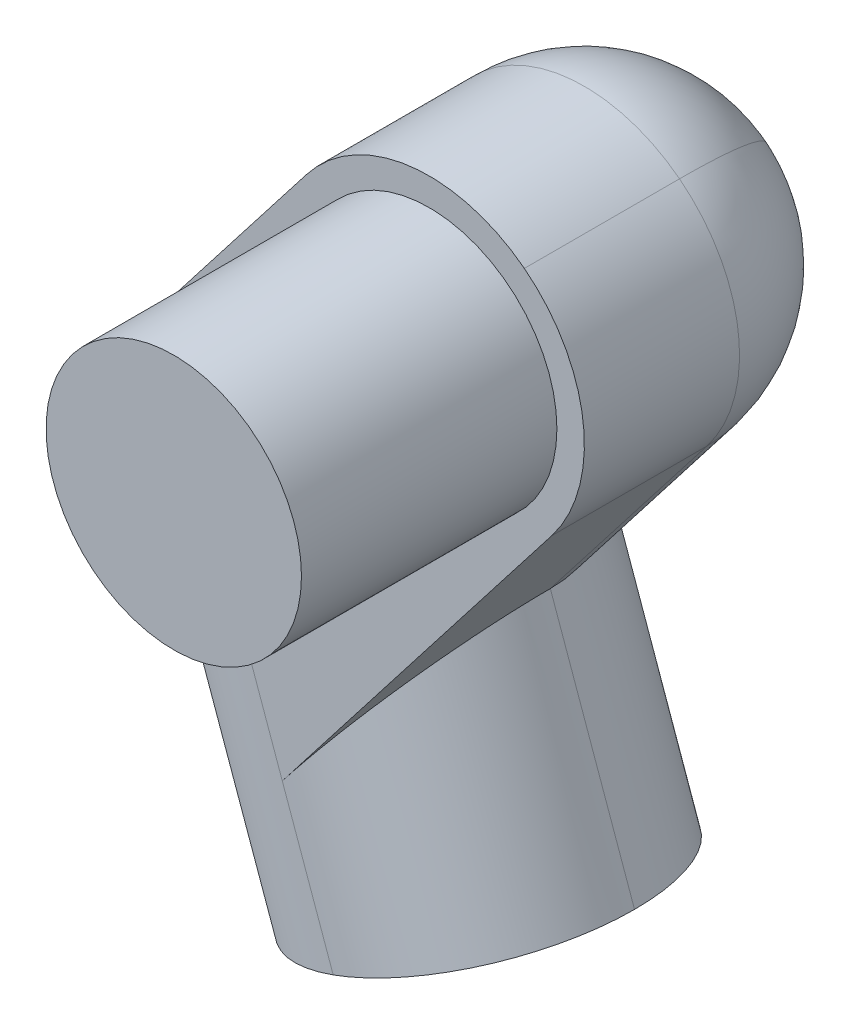
ISO-10303-21;
HEADER;
FILE_DESCRIPTION(('STEP AP214'),'2;1');
FILE_NAME('part.step','',(''),(''),'','','');
FILE_SCHEMA(('AUTOMOTIVE_DESIGN { 1 0 10303 214 1 1 1 1 }'));
ENDSEC;
DATA;
#1=APPLICATION_CONTEXT('core data for automotive mechanical design processes');
#2=APPLICATION_PROTOCOL_DEFINITION('international standard','automotive_design',2000,#1);
#3=PRODUCT_CONTEXT('',#1,'mechanical');
#4=PRODUCT('Part','Part','',(#3));
#5=PRODUCT_RELATED_PRODUCT_CATEGORY('part','',(#4));
#6=PRODUCT_DEFINITION_FORMATION('','',#4);
#7=PRODUCT_DEFINITION_CONTEXT('part definition',#1,'design');
#8=PRODUCT_DEFINITION('design','',#6,#7);
#9=PRODUCT_DEFINITION_SHAPE('','',#8);
#10=(LENGTH_UNIT() NAMED_UNIT(*) SI_UNIT(.MILLI.,.METRE.));
#11=(NAMED_UNIT(*) PLANE_ANGLE_UNIT() SI_UNIT($,.RADIAN.));
#12=(NAMED_UNIT(*) SI_UNIT($,.STERADIAN.) SOLID_ANGLE_UNIT());
#13=UNCERTAINTY_MEASURE_WITH_UNIT(LENGTH_MEASURE(1.E-05),#10,'distance_accuracy_value','');
#14=(GEOMETRIC_REPRESENTATION_CONTEXT(3) GLOBAL_UNCERTAINTY_ASSIGNED_CONTEXT((#13)) GLOBAL_UNIT_ASSIGNED_CONTEXT((#10,
#11,#12)) REPRESENTATION_CONTEXT('',''));
#15=CARTESIAN_POINT('',(0.,0.,0.));
#16=DIRECTION('',(0.,0.,1.));
#17=DIRECTION('',(1.,0.,0.));
#18=AXIS2_PLACEMENT_3D('',#15,#16,#17);
#19=CARTESIAN_POINT('',(-58.6295193195852,184.947102533796,123.444));
#20=DIRECTION('',(0.789946750213018,-0.613175449466049,0.));
#21=DIRECTION('',(0.613175449466049,0.789946750213018,0.));
#22=AXIS2_PLACEMENT_3D('',#19,#20,#21);
#23=PLANE('',#22);
#24=DIRECTION('',(-0.613175449466049,-0.789946750213018,0.));
#25=VECTOR('',#24,1.);
#26=CARTESIAN_POINT('',(-58.6295193195852,184.947102533796,123.444));
#27=LINE('',#26,#25);
#28=CARTESIAN_POINT('',(-96.4759344115287,136.190009217148,123.444));
#29=VERTEX_POINT('',#28);
#30=CARTESIAN_POINT('',(-155.390700532791,60.2908060158817,123.444));
#31=VERTEX_POINT('',#30);
#32=EDGE_CURVE('E96',#29,#31,#27,.T.);
#33=ORIENTED_EDGE('',*,*,#32,.F.);
#34=DIRECTION('',(0.,0.,-1.));
#35=VECTOR('',#34,1.);
#36=CARTESIAN_POINT('',(-96.4759344115287,136.190009217148,123.444));
#37=LINE('',#36,#35);
#38=CARTESIAN_POINT('',(-96.4759344115287,136.190009217148,61.722));
#39=VERTEX_POINT('',#38);
#40=EDGE_CURVE('E161',#29,#39,#37,.T.);
#41=ORIENTED_EDGE('',*,*,#40,.T.);
#42=DIRECTION('',(-0.613175449466049,-0.789946750213018,0.));
#43=VECTOR('',#42,1.);
#44=CARTESIAN_POINT('',(-58.6295193195852,184.947102533796,61.722));
#45=LINE('',#44,#43);
#46=CARTESIAN_POINT('',(-200.278117002444,2.46287308650969,61.722));
#47=VERTEX_POINT('',#46);
#48=EDGE_CURVE('E111',#39,#47,#45,.T.);
#49=ORIENTED_EDGE('',*,*,#48,.T.);
#50=CARTESIAN_POINT('',(-155.390700532791,60.2908060158816,61.722));
#51=DIRECTION('',(0.789946750213018,-0.613175449466049,0.));
#52=DIRECTION('',(0.613175449466049,0.789946750213018,0.));
#53=AXIS2_PLACEMENT_3D('',#50,#51,#52);
#54=ELLIPSE('',#53,73.2048494582426,61.722);
#55=EDGE_CURVE('E110',#47,#31,#54,.F.);
#56=ORIENTED_EDGE('',*,*,#55,.T.);
#57=EDGE_LOOP('',(#33,#41,#49,#56));
#58=FACE_BOUND('',#57,.T.);
#59=ADVANCED_FACE('F35',(#58),#23,.F.);
#60=CARTESIAN_POINT('',(-27.7720310676711,-113.528769442056,123.444));
#61=DIRECTION('',(-0.336336396998156,0.941741911594837,0.));
#62=DIRECTION('',(-0.941741911594838,-0.336336396998156,0.));
#63=AXIS2_PLACEMENT_3D('',#60,#61,#62);
#64=PLANE('',#63);
#65=CARTESIAN_POINT('',(-85.8982253351276,-134.288124537577,61.722));
#66=DIRECTION('',(0.336336396998156,-0.941741911594837,0.));
#67=DIRECTION('',(0.941741911594837,0.336336396998156,0.));
#68=AXIS2_PLACEMENT_3D('',#65,#66,#67);
#69=CIRCLE('',#68,50.8);
#70=CARTESIAN_POINT('',(-38.0577362261099,-117.20223557007,61.722));
#71=VERTEX_POINT('',#70);
#72=EDGE_CURVE('E257',#71,#71,#69,.T.);
#73=ORIENTED_EDGE('',*,*,#72,.F.);
#74=EDGE_LOOP('',(#73));
#75=FACE_BOUND('',#74,.T.);
#76=CARTESIAN_POINT('',(-85.8982253351276,-134.288124537577,61.722));
#77=DIRECTION('',(-0.336336396998156,0.941741911594837,0.));
#78=DIRECTION('',(-0.941741911594838,-0.336336396998156,0.));
#79=AXIS2_PLACEMENT_3D('',#76,#77,#78);
#80=CIRCLE('',#79,61.722);
#81=CARTESIAN_POINT('',(-27.7720310676711,-113.528769442056,61.722));
#82=VERTEX_POINT('',#81);
#83=CARTESIAN_POINT('',(-85.8982253351276,-134.288124537577,123.444));
#84=VERTEX_POINT('',#83);
#85=EDGE_CURVE('E129',#82,#84,#80,.F.);
#86=ORIENTED_EDGE('',*,*,#85,.T.);
#87=CARTESIAN_POINT('',(-85.8982253351276,-134.288124537577,61.722));
#88=DIRECTION('',(-0.336336396998156,0.941741911594837,0.));
#89=DIRECTION('',(-0.941741911594838,-0.336336396998156,0.));
#90=AXIS2_PLACEMENT_3D('',#87,#88,#89);
#91=CIRCLE('',#90,61.722);
#92=CARTESIAN_POINT('',(-144.024419602584,-155.047479633097,61.722));
#93=VERTEX_POINT('',#92);
#94=EDGE_CURVE('E131',#84,#93,#91,.F.);
#95=ORIENTED_EDGE('',*,*,#94,.T.);
#96=CARTESIAN_POINT('',(-85.8982253351276,-134.288124537577,61.722));
#97=DIRECTION('',(-0.336336396998156,0.941741911594837,0.));
#98=DIRECTION('',(-0.941741911594838,-0.336336396998156,0.));
#99=AXIS2_PLACEMENT_3D('',#96,#97,#98);
#100=CIRCLE('',#99,61.722);
#101=CARTESIAN_POINT('',(-85.8982253351276,-134.288124537577,0.));
#102=VERTEX_POINT('',#101);
#103=EDGE_CURVE('E124',#93,#102,#100,.F.);
#104=ORIENTED_EDGE('',*,*,#103,.T.);
#105=CARTESIAN_POINT('',(-85.8982253351276,-134.288124537577,61.722));
#106=DIRECTION('',(-0.336336396998156,0.941741911594837,0.));
#107=DIRECTION('',(-0.941741911594838,-0.336336396998156,0.));
#108=AXIS2_PLACEMENT_3D('',#105,#106,#107);
#109=CIRCLE('',#108,61.722);
#110=EDGE_CURVE('E122',#102,#82,#109,.F.);
#111=ORIENTED_EDGE('',*,*,#110,.T.);
#112=EDGE_LOOP('',(#86,#95,#104,#111));
#113=FACE_BOUND('',#112,.T.);
#114=ADVANCED_FACE('F205',(#75,#113),#64,.F.);
#115=CARTESIAN_POINT('',(-61.2603734439835,-19.7614107883817,123.444));
#116=DIRECTION('',(-0.789946750213018,0.613175449466049,0.));
#117=DIRECTION('',(-0.61317544946605,-0.789946750213018,0.));
#118=AXIS2_PLACEMENT_3D('',#115,#116,#117);
#119=PLANE('',#118);
#120=DIRECTION('',(0.61317544946605,0.789946750213018,0.));
#121=VECTOR('',#120,1.);
#122=CARTESIAN_POINT('',(-61.2603734439835,-19.7614107883817,61.722));
#123=LINE('',#122,#121);
#124=CARTESIAN_POINT('',(-61.2603734439835,-19.7614107883817,61.722));
#125=VERTEX_POINT('',#124);
#126=CARTESIAN_POINT('',(1.03825222176712,60.4971790332609,61.722));
#127=VERTEX_POINT('',#126);
#128=EDGE_CURVE('E114',#125,#127,#123,.T.);
#129=ORIENTED_EDGE('',*,*,#128,.T.);
#130=DIRECTION('',(0.,0.,-1.));
#131=VECTOR('',#130,1.);
#132=CARTESIAN_POINT('',(1.03825222176712,60.4971790332609,123.444));
#133=LINE('',#132,#131);
#134=CARTESIAN_POINT('',(1.03825222176712,60.4971790332609,123.444));
#135=VERTEX_POINT('',#134);
#136=EDGE_CURVE('E139',#127,#135,#133,.F.);
#137=ORIENTED_EDGE('',*,*,#136,.T.);
#138=DIRECTION('',(0.61317544946605,0.789946750213018,0.));
#139=VECTOR('',#138,1.);
#140=CARTESIAN_POINT('',(-61.2603734439835,-19.7614107883817,123.444));
#141=LINE('',#140,#139);
#142=CARTESIAN_POINT('',(-106.147789913636,-77.5893437177536,123.444));
#143=VERTEX_POINT('',#142);
#144=EDGE_CURVE('E106',#143,#135,#141,.T.);
#145=ORIENTED_EDGE('',*,*,#144,.F.);
#146=CARTESIAN_POINT('',(-106.147789913636,-77.5893437177536,61.722));
#147=DIRECTION('',(-0.789946750213018,0.613175449466049,0.));
#148=DIRECTION('',(-0.61317544946605,-0.789946750213018,0.));
#149=AXIS2_PLACEMENT_3D('',#146,#147,#148);
#150=ELLIPSE('',#149,73.2048494582426,61.722);
#151=EDGE_CURVE('E137',#143,#125,#150,.T.);
#152=ORIENTED_EDGE('',*,*,#151,.T.);
#153=EDGE_LOOP('',(#129,#137,#145,#152));
#154=FACE_BOUND('',#153,.T.);
#155=ADVANCED_FACE('F189',(#154),#119,.F.);
#156=CARTESIAN_POINT('',(0.,0.,123.444));
#157=DIRECTION('',(0.,0.,1.));
#158=DIRECTION('',(1.,0.,0.));
#159=AXIS2_PLACEMENT_3D('',#156,#157,#158);
#160=PLANE('',#159);
#161=CARTESIAN_POINT('',(-47.7188410948807,98.3435941252044,123.444));
#162=DIRECTION('',(0.,0.,1.));
#163=DIRECTION('',(1.,0.,0.));
#164=AXIS2_PLACEMENT_3D('',#161,#162,#163);
#165=CIRCLE('',#164,50.8);
#166=CARTESIAN_POINT('',(3.08115890511925,98.3435941252044,123.444));
#167=VERTEX_POINT('',#166);
#168=EDGE_CURVE('E256',#167,#167,#165,.T.);
#169=ORIENTED_EDGE('',*,*,#168,.F.);
#170=EDGE_LOOP('',(#169));
#171=FACE_BOUND('',#170,.T.);
#172=ORIENTED_EDGE('',*,*,#144,.T.);
#173=CARTESIAN_POINT('',(-47.7188410948808,98.3435941252044,123.444));
#174=DIRECTION('',(0.,0.,1.));
#175=DIRECTION('',(1.,0.,0.));
#176=AXIS2_PLACEMENT_3D('',#173,#174,#175);
#177=CIRCLE('',#176,61.722);
#178=CARTESIAN_POINT('',(-9.87242600293724,147.100687441852,123.444));
#179=VERTEX_POINT('',#178);
#180=EDGE_CURVE('E159',#135,#179,#177,.T.);
#181=ORIENTED_EDGE('',*,*,#180,.T.);
#182=CARTESIAN_POINT('',(-47.7188410948808,98.3435941252044,123.444));
#183=DIRECTION('',(0.,0.,1.));
#184=DIRECTION('',(1.,0.,0.));
#185=AXIS2_PLACEMENT_3D('',#182,#183,#184);
#186=CIRCLE('',#185,61.722);
#187=EDGE_CURVE('E103',#179,#29,#186,.T.);
#188=ORIENTED_EDGE('',*,*,#187,.T.);
#189=ORIENTED_EDGE('',*,*,#32,.T.);
#190=DIRECTION('',(0.336336396998156,-0.941741911594838,0.));
#191=VECTOR('',#190,1.);
#192=CARTESIAN_POINT('',(-85.8982253351276,-134.288124537577,123.444));
#193=LINE('',#192,#191);
#194=EDGE_CURVE('E101',#31,#143,#193,.T.);
#195=ORIENTED_EDGE('',*,*,#194,.T.);
#196=EDGE_LOOP('',(#172,#181,#188,#189,#195));
#197=FACE_BOUND('',#196,.T.);
#198=ADVANCED_FACE('F99',(#171,#197),#160,.T.);
#199=CARTESIAN_POINT('',(-110.017466760631,18.0850043035618,61.722));
#200=DIRECTION('',(0.61317544946605,0.789946750213018,0.));
#201=DIRECTION('',(-0.789946750213018,0.61317544946605,0.));
#202=AXIS2_PLACEMENT_3D('',#199,#200,#201);
#203=CYLINDRICAL_SURFACE('',#202,61.722);
#204=DIRECTION('',(0.61317544946605,0.789946750213018,0.));
#205=VECTOR('',#204,1.);
#206=CARTESIAN_POINT('',(-77.4125862404207,60.0894900187881,0.));
#207=LINE('',#206,#205);
#208=CARTESIAN_POINT('',(-47.7188410948808,98.3435941252044,0.));
#209=VERTEX_POINT('',#208);
#210=CARTESIAN_POINT('',(-130.769245223214,-8.64926885093604,0.));
#211=VERTEX_POINT('',#210);
#212=EDGE_CURVE('E107',#209,#211,#207,.F.);
#213=ORIENTED_EDGE('',*,*,#212,.F.);
#214=CARTESIAN_POINT('',(-47.7188410948808,98.3435941252044,61.722));
#215=DIRECTION('',(0.61317544946605,0.789946750213018,0.));
#216=DIRECTION('',(-0.789946750213018,0.61317544946605,0.));
#217=AXIS2_PLACEMENT_3D('',#214,#215,#216);
#218=CIRCLE('',#217,61.722);
#219=EDGE_CURVE('E11',#209,#127,#218,.F.);
#220=ORIENTED_EDGE('',*,*,#219,.T.);
#221=ORIENTED_EDGE('',*,*,#128,.F.);
#222=CARTESIAN_POINT('',(-130.769245223214,-8.64926885093602,61.722));
#223=DIRECTION('',(0.15786199035095,0.987461185061183,0.));
#224=DIRECTION('',(-0.987461185061183,0.15786199035095,0.));
#225=AXIS2_PLACEMENT_3D('',#222,#223,#224);
#226=ELLIPSE('',#225,70.3914977426918,61.722);
#227=EDGE_CURVE('E152',#211,#125,#226,.F.);
#228=ORIENTED_EDGE('',*,*,#227,.F.);
#229=EDGE_LOOP('',(#213,#220,#221,#228));
#230=FACE_BOUND('',#229,.T.);
#231=ADVANCED_FACE('F185',(#230),#203,.T.);
#232=CARTESIAN_POINT('',(-9.87242600293726,147.100687441852,61.722));
#233=DIRECTION('',(-0.613175449466049,-0.789946750213018,0.));
#234=DIRECTION('',(0.789946750213018,-0.613175449466049,0.));
#235=AXIS2_PLACEMENT_3D('',#232,#233,#234);
#236=CYLINDRICAL_SURFACE('',#235,61.722);
#237=ORIENTED_EDGE('',*,*,#48,.F.);
#238=CARTESIAN_POINT('',(-47.7188410948808,98.3435941252044,61.722));
#239=DIRECTION('',(-0.613175449466049,-0.789946750213018,0.));
#240=DIRECTION('',(0.789946750213018,-0.613175449466049,0.));
#241=AXIS2_PLACEMENT_3D('',#238,#239,#240);
#242=CIRCLE('',#241,61.722);
#243=EDGE_CURVE('E45',#39,#209,#242,.T.);
#244=ORIENTED_EDGE('',*,*,#243,.T.);
#245=ORIENTED_EDGE('',*,*,#212,.T.);
#246=CARTESIAN_POINT('',(-130.769245223214,-8.64926885093609,61.722));
#247=DIRECTION('',(-0.15786199035095,-0.987461185061183,0.));
#248=DIRECTION('',(0.987461185061183,-0.15786199035095,0.));
#249=AXIS2_PLACEMENT_3D('',#246,#247,#248);
#250=ELLIPSE('',#249,70.3914977426918,61.722);
#251=EDGE_CURVE('E146',#47,#211,#250,.T.);
#252=ORIENTED_EDGE('',*,*,#251,.F.);
#253=EDGE_LOOP('',(#237,#244,#245,#252));
#254=FACE_BOUND('',#253,.T.);
#255=ADVANCED_FACE('F227',(#254),#236,.T.);
#256=CARTESIAN_POINT('',(-119.38656771144,-40.5207658839019,61.722));
#257=DIRECTION('',(-0.336336396998156,0.941741911594838,0.));
#258=DIRECTION('',(-0.941741911594838,-0.336336396998156,0.));
#259=AXIS2_PLACEMENT_3D('',#256,#257,#258);
#260=CYLINDRICAL_SURFACE('',#259,61.722);
#261=DIRECTION('',(-0.336336396998156,0.941741911594838,0.));
#262=VECTOR('',#261,1.);
#263=CARTESIAN_POINT('',(-61.2603734439835,-19.7614107883817,61.722));
#264=LINE('',#263,#262);
#265=EDGE_CURVE('E143',#82,#125,#264,.T.);
#266=ORIENTED_EDGE('',*,*,#265,.F.);
#267=ORIENTED_EDGE('',*,*,#110,.F.);
#268=DIRECTION('',(-0.336336396998156,0.941741911594838,0.));
#269=VECTOR('',#268,1.);
#270=CARTESIAN_POINT('',(-118.715931598712,-42.3985469995401,0.));
#271=LINE('',#270,#269);
#272=EDGE_CURVE('E149',#211,#102,#271,.F.);
#273=ORIENTED_EDGE('',*,*,#272,.F.);
#274=ORIENTED_EDGE('',*,*,#227,.T.);
#275=EDGE_LOOP('',(#266,#267,#273,#274));
#276=FACE_BOUND('',#275,.T.);
#277=ADVANCED_FACE('F223',(#276),#260,.T.);
#278=CARTESIAN_POINT('',(-85.8982253351276,-134.288124537577,61.722));
#279=DIRECTION('',(0.336336396998156,-0.941741911594838,0.));
#280=DIRECTION('',(0.941741911594838,0.336336396998156,0.));
#281=AXIS2_PLACEMENT_3D('',#278,#279,#280);
#282=CYLINDRICAL_SURFACE('',#281,61.722);
#283=ORIENTED_EDGE('',*,*,#272,.T.);
#284=ORIENTED_EDGE('',*,*,#103,.F.);
#285=DIRECTION('',(0.336336396998156,-0.941741911594838,0.));
#286=VECTOR('',#285,1.);
#287=CARTESIAN_POINT('',(-144.024419602584,-155.047479633097,61.722));
#288=LINE('',#287,#286);
#289=EDGE_CURVE('E141',#47,#93,#288,.T.);
#290=ORIENTED_EDGE('',*,*,#289,.F.);
#291=ORIENTED_EDGE('',*,*,#251,.T.);
#292=EDGE_LOOP('',(#283,#284,#290,#291));
#293=FACE_BOUND('',#292,.T.);
#294=ADVANCED_FACE('F219',(#293),#282,.T.);
#295=CARTESIAN_POINT('',(-118.715931598712,-42.3985469995401,61.722));
#296=DIRECTION('',(0.336336396998156,-0.941741911594838,0.));
#297=DIRECTION('',(0.941741911594838,0.336336396998156,0.));
#298=AXIS2_PLACEMENT_3D('',#295,#296,#297);
#299=CYLINDRICAL_SURFACE('',#298,61.722);
#300=ORIENTED_EDGE('',*,*,#265,.T.);
#301=ORIENTED_EDGE('',*,*,#151,.F.);
#302=DIRECTION('',(-0.336336396998156,0.941741911594838,0.));
#303=VECTOR('',#302,1.);
#304=CARTESIAN_POINT('',(-119.38656771144,-40.5207658839019,123.444));
#305=LINE('',#304,#303);
#306=EDGE_CURVE('E120',#84,#143,#305,.T.);
#307=ORIENTED_EDGE('',*,*,#306,.F.);
#308=ORIENTED_EDGE('',*,*,#85,.F.);
#309=EDGE_LOOP('',(#300,#301,#307,#308));
#310=FACE_BOUND('',#309,.T.);
#311=ADVANCED_FACE('F216',(#310),#299,.T.);
#312=CARTESIAN_POINT('',(-118.715931598712,-42.39854699954,61.722));
#313=DIRECTION('',(-0.336336396998156,0.941741911594838,0.));
#314=DIRECTION('',(-0.941741911594838,-0.336336396998156,0.));
#315=AXIS2_PLACEMENT_3D('',#312,#313,#314);
#316=CYLINDRICAL_SURFACE('',#315,61.722);
#317=ORIENTED_EDGE('',*,*,#55,.F.);
#318=ORIENTED_EDGE('',*,*,#289,.T.);
#319=ORIENTED_EDGE('',*,*,#94,.F.);
#320=ORIENTED_EDGE('',*,*,#306,.T.);
#321=ORIENTED_EDGE('',*,*,#194,.F.);
#322=EDGE_LOOP('',(#317,#318,#319,#320,#321));
#323=FACE_BOUND('',#322,.T.);
#324=ADVANCED_FACE('F117',(#323),#316,.T.);
#325=CARTESIAN_POINT('',(-47.7188410948808,98.3435941252044,61.722));
#326=DIRECTION('',(-0.613175449466049,-0.789946750213018,0.));
#327=DIRECTION('',(0.789946750213018,-0.613175449466049,0.));
#328=AXIS2_PLACEMENT_3D('',#325,#326,#327);
#329=SPHERICAL_SURFACE('',#328,61.722);
#330=CARTESIAN_POINT('',(-47.7188410948808,98.3435941252044,61.722));
#331=DIRECTION('',(0.789946750213018,-0.613175449466049,0.));
#332=DIRECTION('',(0.613175449466049,0.789946750213018,0.));
#333=AXIS2_PLACEMENT_3D('',#330,#331,#332);
#334=CIRCLE('',#333,61.722);
#335=CARTESIAN_POINT('',(-9.87242600293726,147.100687441852,61.722));
#336=VERTEX_POINT('',#335);
#337=EDGE_CURVE('E170',#209,#336,#334,.T.);
#338=ORIENTED_EDGE('',*,*,#337,.F.);
#339=ORIENTED_EDGE('',*,*,#243,.F.);
#340=CARTESIAN_POINT('',(-47.7188410948808,98.3435941252044,61.722));
#341=DIRECTION('',(0.,0.,1.));
#342=DIRECTION('',(1.,0.,0.));
#343=AXIS2_PLACEMENT_3D('',#340,#341,#342);
#344=CIRCLE('',#343,61.722);
#345=EDGE_CURVE('E39',#336,#39,#344,.T.);
#346=ORIENTED_EDGE('',*,*,#345,.F.);
#347=EDGE_LOOP('',(#338,#339,#346));
#348=FACE_BOUND('',#347,.T.);
#349=ADVANCED_FACE('F37',(#348),#329,.T.);
#350=CARTESIAN_POINT('',(-47.7188410948808,98.3435941252044,123.444));
#351=DIRECTION('',(0.,0.,-1.));
#352=DIRECTION('',(-1.,0.,0.));
#353=AXIS2_PLACEMENT_3D('',#350,#351,#352);
#354=CYLINDRICAL_SURFACE('',#353,61.722);
#355=ORIENTED_EDGE('',*,*,#40,.F.);
#356=ORIENTED_EDGE('',*,*,#187,.F.);
#357=DIRECTION('',(0.,0.,-1.));
#358=VECTOR('',#357,1.);
#359=CARTESIAN_POINT('',(-9.87242600293726,147.100687441852,123.444));
#360=LINE('',#359,#358);
#361=EDGE_CURVE('E167',#336,#179,#360,.F.);
#362=ORIENTED_EDGE('',*,*,#361,.F.);
#363=ORIENTED_EDGE('',*,*,#345,.T.);
#364=EDGE_LOOP('',(#355,#356,#362,#363));
#365=FACE_BOUND('',#364,.T.);
#366=ADVANCED_FACE('F180',(#365),#354,.T.);
#367=CARTESIAN_POINT('',(-47.7188410948808,98.3435941252044,61.722));
#368=DIRECTION('',(-0.613175449466049,-0.789946750213018,0.));
#369=DIRECTION('',(0.789946750213018,-0.613175449466049,0.));
#370=AXIS2_PLACEMENT_3D('',#367,#368,#369);
#371=SPHERICAL_SURFACE('',#370,61.722);
#372=ORIENTED_EDGE('',*,*,#219,.F.);
#373=ORIENTED_EDGE('',*,*,#337,.T.);
#374=CARTESIAN_POINT('',(-47.7188410948808,98.3435941252044,61.722));
#375=DIRECTION('',(0.,0.,1.));
#376=DIRECTION('',(1.,0.,0.));
#377=AXIS2_PLACEMENT_3D('',#374,#375,#376);
#378=CIRCLE('',#377,61.722);
#379=EDGE_CURVE('E164',#127,#336,#378,.T.);
#380=ORIENTED_EDGE('',*,*,#379,.F.);
#381=EDGE_LOOP('',(#372,#373,#380));
#382=FACE_BOUND('',#381,.T.);
#383=ADVANCED_FACE('F182',(#382),#371,.T.);
#384=CARTESIAN_POINT('',(-47.7188410948808,98.3435941252044,123.444));
#385=DIRECTION('',(0.,0.,-1.));
#386=DIRECTION('',(-1.,0.,0.));
#387=AXIS2_PLACEMENT_3D('',#384,#385,#386);
#388=CYLINDRICAL_SURFACE('',#387,61.722);
#389=ORIENTED_EDGE('',*,*,#180,.F.);
#390=ORIENTED_EDGE('',*,*,#136,.F.);
#391=ORIENTED_EDGE('',*,*,#379,.T.);
#392=ORIENTED_EDGE('',*,*,#361,.T.);
#393=EDGE_LOOP('',(#389,#390,#391,#392));
#394=FACE_BOUND('',#393,.T.);
#395=ADVANCED_FACE('F191',(#394),#388,.T.);
#396=CARTESIAN_POINT('',(-47.7188410948807,98.3435941252044,225.044));
#397=DIRECTION('',(0.,0.,-1.));
#398=DIRECTION('',(-1.,0.,0.));
#399=AXIS2_PLACEMENT_3D('',#396,#397,#398);
#400=CYLINDRICAL_SURFACE('',#399,50.8);
#401=CARTESIAN_POINT('',(-47.7188410948807,98.3435941252044,225.044));
#402=DIRECTION('',(0.,0.,1.));
#403=DIRECTION('',(1.,0.,0.));
#404=AXIS2_PLACEMENT_3D('',#401,#402,#403);
#405=CIRCLE('',#404,50.8);
#406=CARTESIAN_POINT('',(3.08115890511925,98.3435941252044,225.044));
#407=VERTEX_POINT('',#406);
#408=EDGE_CURVE('E168',#407,#407,#405,.T.);
#409=ORIENTED_EDGE('',*,*,#408,.F.);
#410=EDGE_LOOP('',(#409));
#411=FACE_BOUND('',#410,.T.);
#412=ORIENTED_EDGE('',*,*,#168,.T.);
#413=EDGE_LOOP('',(#412));
#414=FACE_BOUND('',#413,.T.);
#415=ADVANCED_FACE('F193',(#411,#414),#400,.T.);
#416=CARTESIAN_POINT('',(-47.7188410948807,98.3435941252044,225.044));
#417=DIRECTION('',(0.,0.,1.));
#418=DIRECTION('',(1.,0.,0.));
#419=AXIS2_PLACEMENT_3D('',#416,#417,#418);
#420=PLANE('',#419);
#421=ORIENTED_EDGE('',*,*,#408,.T.);
#422=EDGE_LOOP('',(#421));
#423=FACE_BOUND('',#422,.T.);
#424=ADVANCED_FACE('F199',(#423),#420,.T.);
#425=CARTESIAN_POINT('',(-120.07000327014,-38.6071463195413,61.722));
#426=DIRECTION('',(0.336336396998156,-0.941741911594837,0.));
#427=DIRECTION('',(0.941741911594837,0.336336396998156,0.));
#428=AXIS2_PLACEMENT_3D('',#425,#426,#427);
#429=CYLINDRICAL_SURFACE('',#428,50.8);
#430=CARTESIAN_POINT('',(-120.07000327014,-38.6071463195413,61.722));
#431=DIRECTION('',(0.336336396998156,-0.941741911594837,0.));
#432=DIRECTION('',(0.941741911594837,0.336336396998156,0.));
#433=AXIS2_PLACEMENT_3D('',#430,#431,#432);
#434=CIRCLE('',#433,50.8);
#435=CARTESIAN_POINT('',(-72.2295141611225,-21.5212573520349,61.722));
#436=VERTEX_POINT('',#435);
#437=EDGE_CURVE('E255',#436,#436,#434,.T.);
#438=ORIENTED_EDGE('',*,*,#437,.F.);
#439=EDGE_LOOP('',(#438));
#440=FACE_BOUND('',#439,.T.);
#441=ORIENTED_EDGE('',*,*,#72,.T.);
#442=EDGE_LOOP('',(#441));
#443=FACE_BOUND('',#442,.T.);
#444=ADVANCED_FACE('F243',(#440,#443),#429,.F.);
#445=CARTESIAN_POINT('',(-120.07000327014,-38.6071463195413,61.722));
#446=DIRECTION('',(0.336336396998156,-0.941741911594837,0.));
#447=DIRECTION('',(0.941741911594837,0.336336396998156,0.));
#448=AXIS2_PLACEMENT_3D('',#445,#446,#447);
#449=PLANE('',#448);
#450=ORIENTED_EDGE('',*,*,#437,.T.);
#451=EDGE_LOOP('',(#450));
#452=FACE_BOUND('',#451,.T.);
#453=ADVANCED_FACE('F247',(#452),#449,.T.);
#454=CLOSED_SHELL('',(#59,#114,#155,#198,#231,#255,#277,#294,#311,#324,#349,#366,#383,#395,#415,
#424,#444,#453));
#455=MANIFOLD_SOLID_BREP('B2',#454);
#456=ADVANCED_BREP_SHAPE_REPRESENTATION('',(#18,#455),#14);
#457=SHAPE_DEFINITION_REPRESENTATION(#9,#456);
ENDSEC;
END-ISO-10303-21;
